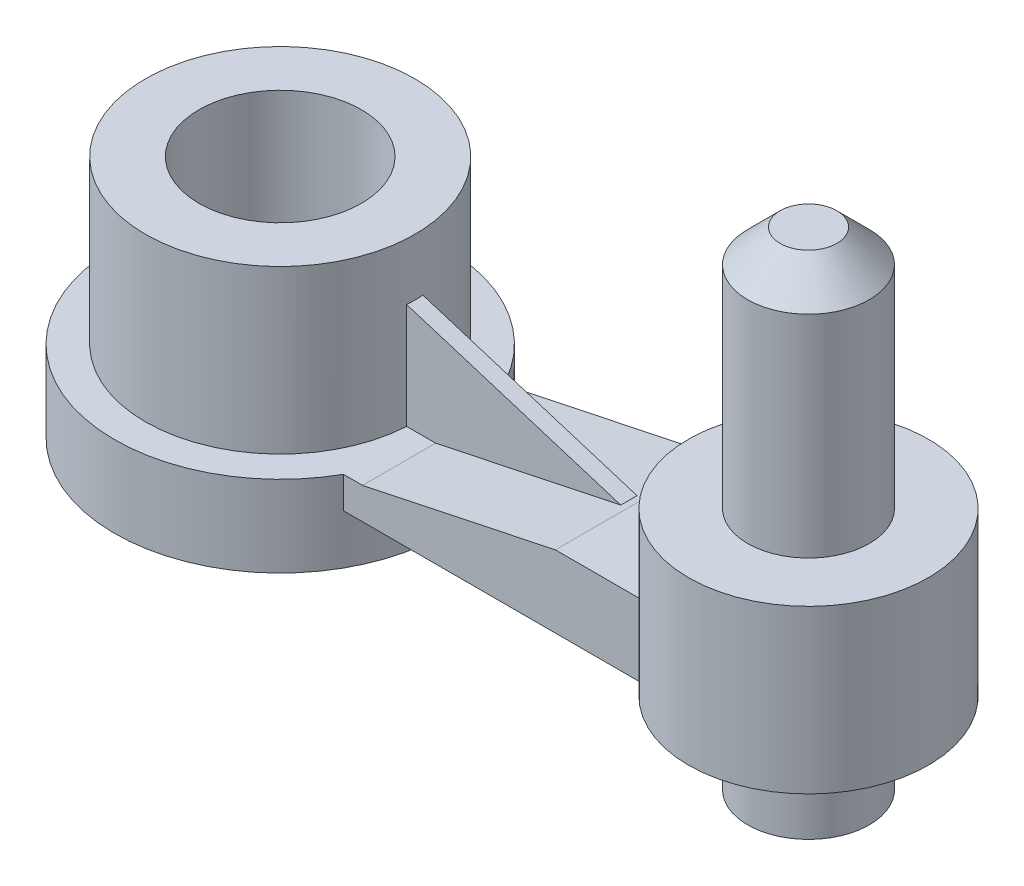
ISO-10303-21;
HEADER;
FILE_DESCRIPTION(('STEP AP214'),'2;1');
FILE_NAME('part.step','',(''),(''),'','','');
FILE_SCHEMA(('AUTOMOTIVE_DESIGN { 1 0 10303 214 1 1 1 1 }'));
ENDSEC;
DATA;
#1=APPLICATION_CONTEXT('core data for automotive mechanical design processes');
#2=APPLICATION_PROTOCOL_DEFINITION('international standard','automotive_design',2000,#1);
#3=PRODUCT_CONTEXT('',#1,'mechanical');
#4=PRODUCT('Part','Part','',(#3));
#5=PRODUCT_RELATED_PRODUCT_CATEGORY('part','',(#4));
#6=PRODUCT_DEFINITION_FORMATION('','',#4);
#7=PRODUCT_DEFINITION_CONTEXT('part definition',#1,'design');
#8=PRODUCT_DEFINITION('design','',#6,#7);
#9=PRODUCT_DEFINITION_SHAPE('','',#8);
#10=(LENGTH_UNIT() NAMED_UNIT(*) SI_UNIT(.MILLI.,.METRE.));
#11=(NAMED_UNIT(*) PLANE_ANGLE_UNIT() SI_UNIT($,.RADIAN.));
#12=(NAMED_UNIT(*) SI_UNIT($,.STERADIAN.) SOLID_ANGLE_UNIT());
#13=UNCERTAINTY_MEASURE_WITH_UNIT(LENGTH_MEASURE(1.E-05),#10,'distance_accuracy_value','');
#14=(GEOMETRIC_REPRESENTATION_CONTEXT(3) GLOBAL_UNCERTAINTY_ASSIGNED_CONTEXT((#13)) GLOBAL_UNIT_ASSIGNED_CONTEXT((#10,
#11,#12)) REPRESENTATION_CONTEXT('',''));
#15=CARTESIAN_POINT('',(0.,0.,0.));
#16=DIRECTION('',(0.,0.,1.));
#17=DIRECTION('',(1.,0.,0.));
#18=AXIS2_PLACEMENT_3D('',#15,#16,#17);
#19=CARTESIAN_POINT('',(15.2001557817542,20.5,0.612730337909637));
#20=DIRECTION('',(0.,-1.,0.));
#21=DIRECTION('',(0.,0.,1.));
#22=AXIS2_PLACEMENT_3D('',#19,#20,#21);
#23=CONICAL_SURFACE('',#22,3.745,0.78539816339745);
#24=CARTESIAN_POINT('',(15.2001557817542,22.5,0.612730337909637));
#25=DIRECTION('',(0.,1.,0.));
#26=DIRECTION('',(0.,0.,1.));
#27=AXIS2_PLACEMENT_3D('',#24,#25,#26);
#28=CIRCLE('',#27,1.745);
#29=CARTESIAN_POINT('',(15.2001557817542,22.5,2.35773033790963));
#30=VERTEX_POINT('',#29);
#31=EDGE_CURVE('E13',#30,#30,#28,.T.);
#32=ORIENTED_EDGE('',*,*,#31,.F.);
#33=EDGE_LOOP('',(#32));
#34=FACE_BOUND('',#33,.T.);
#35=CARTESIAN_POINT('',(15.2001557817542,20.5,0.612730337909637));
#36=DIRECTION('',(0.,1.,0.));
#37=DIRECTION('',(0.,0.,1.));
#38=AXIS2_PLACEMENT_3D('',#35,#36,#37);
#39=CIRCLE('',#38,3.745);
#40=CARTESIAN_POINT('',(15.2001557817542,20.5,4.35773033790964));
#41=VERTEX_POINT('',#40);
#42=EDGE_CURVE('E71',#41,#41,#39,.T.);
#43=ORIENTED_EDGE('',*,*,#42,.T.);
#44=EDGE_LOOP('',(#43));
#45=FACE_BOUND('',#44,.T.);
#46=ADVANCED_FACE('F65',(#34,#45),#23,.T.);
#47=CARTESIAN_POINT('',(15.2001557817542,22.5,0.612730337909637));
#48=DIRECTION('',(0.,1.,0.));
#49=DIRECTION('',(0.,0.,1.));
#50=AXIS2_PLACEMENT_3D('',#47,#48,#49);
#51=PLANE('',#50);
#52=ORIENTED_EDGE('',*,*,#31,.T.);
#53=EDGE_LOOP('',(#52));
#54=FACE_BOUND('',#53,.T.);
#55=ADVANCED_FACE('F80',(#54),#51,.T.);
#56=CARTESIAN_POINT('',(15.2001557817542,20.5,0.612730337909637));
#57=DIRECTION('',(0.,1.,0.));
#58=DIRECTION('',(0.,0.,1.));
#59=AXIS2_PLACEMENT_3D('',#56,#57,#58);
#60=PLANE('',#59);
#61=ORIENTED_EDGE('',*,*,#42,.F.);
#62=EDGE_LOOP('',(#61));
#63=FACE_BOUND('',#62,.T.);
#64=ADVANCED_FACE('F78',(#63),#60,.F.);
#65=CLOSED_SHELL('',(#46,#55,#64));
#66=MANIFOLD_SOLID_BREP('B2',#65);
#67=CARTESIAN_POINT('',(-17.3198442182458,0.,0.612730337909637));
#68=DIRECTION('',(0.,-1.,0.));
#69=DIRECTION('',(0.,0.,-1.));
#70=AXIS2_PLACEMENT_3D('',#67,#68,#69);
#71=PLANE('',#70);
#72=DIRECTION('',(0.,0.,-1.));
#73=VECTOR('',#72,1.);
#74=CARTESIAN_POINT('',(-7.2574485575352,0.,5.61));
#75=LINE('',#74,#73);
#76=CARTESIAN_POINT('',(-7.2574485575352,0.,5.61));
#77=VERTEX_POINT('',#76);
#78=CARTESIAN_POINT('',(-7.2574485575352,0.,1.11));
#79=VERTEX_POINT('',#78);
#80=EDGE_CURVE('E200',#77,#79,#75,.T.);
#81=ORIENTED_EDGE('',*,*,#80,.T.);
#82=DIRECTION('',(1.,0.,0.));
#83=VECTOR('',#82,1.);
#84=CARTESIAN_POINT('',(-12.1241876091032,0.,1.11));
#85=LINE('',#84,#83);
#86=CARTESIAN_POINT('',(-9.03976282473492,0.,1.11));
#87=VERTEX_POINT('',#86);
#88=EDGE_CURVE('E295',#87,#79,#85,.T.);
#89=ORIENTED_EDGE('',*,*,#88,.F.);
#90=CARTESIAN_POINT('',(-17.3198442182458,0.,0.612730337909637));
#91=DIRECTION('',(0.,1.,0.));
#92=DIRECTION('',(0.,0.,1.));
#93=AXIS2_PLACEMENT_3D('',#90,#91,#92);
#94=CIRCLE('',#93,8.295);
#95=CARTESIAN_POINT('',(-9.04009257901496,0.,0.11));
#96=VERTEX_POINT('',#95);
#97=EDGE_CURVE('E233',#96,#87,#94,.T.);
#98=ORIENTED_EDGE('',*,*,#97,.F.);
#99=DIRECTION('',(1.,0.,0.));
#100=VECTOR('',#99,1.);
#101=CARTESIAN_POINT('',(-12.1241876091032,0.,0.11));
#102=LINE('',#101,#100);
#103=CARTESIAN_POINT('',(-7.2574485575352,0.,0.11));
#104=VERTEX_POINT('',#103);
#105=EDGE_CURVE('E129',#96,#104,#102,.T.);
#106=ORIENTED_EDGE('',*,*,#105,.T.);
#107=CARTESIAN_POINT('',(-7.2574485575352,0.,-4.39));
#108=VERTEX_POINT('',#107);
#109=EDGE_CURVE('E203',#104,#108,#75,.T.);
#110=ORIENTED_EDGE('',*,*,#109,.T.);
#111=DIRECTION('',(-1.,0.,0.));
#112=VECTOR('',#111,1.);
#113=CARTESIAN_POINT('',(-7.12484421824576,0.,-4.39));
#114=LINE('',#113,#112);
#115=CARTESIAN_POINT('',(-8.43667394147191,0.,-4.39));
#116=VERTEX_POINT('',#115);
#117=EDGE_CURVE('E258',#108,#116,#114,.T.);
#118=ORIENTED_EDGE('',*,*,#117,.T.);
#119=CARTESIAN_POINT('',(-17.3198442182458,0.,0.612730337909637));
#120=DIRECTION('',(0.,-1.,0.));
#121=DIRECTION('',(0.,0.,-1.));
#122=AXIS2_PLACEMENT_3D('',#119,#120,#121);
#123=CIRCLE('',#122,10.195);
#124=CARTESIAN_POINT('',(-8.43360086549252,0.,5.61));
#125=VERTEX_POINT('',#124);
#126=EDGE_CURVE('E229',#125,#116,#123,.T.);
#127=ORIENTED_EDGE('',*,*,#126,.F.);
#128=DIRECTION('',(-1.,0.,0.));
#129=VECTOR('',#128,1.);
#130=CARTESIAN_POINT('',(-7.12484421824576,0.,5.61));
#131=LINE('',#130,#129);
#132=EDGE_CURVE('E256',#77,#125,#131,.T.);
#133=ORIENTED_EDGE('',*,*,#132,.F.);
#134=EDGE_LOOP('',(#81,#89,#98,#106,#110,#118,#127,#133));
#135=FACE_BOUND('',#134,.T.);
#136=ADVANCED_FACE('F114',(#135),#71,.F.);
#137=CARTESIAN_POINT('',(-9.02484421824577,6.49584873086382,1.11));
#138=DIRECTION('',(-0.297041581577032,-0.954864544746644,0.));
#139=DIRECTION('',(0.954864544746644,-0.297041581577032,0.));
#140=AXIS2_PLACEMENT_3D('',#137,#138,#139);
#141=PLANE('',#140);
#142=DIRECTION('',(0.,0.,1.));
#143=VECTOR('',#142,1.);
#144=CARTESIAN_POINT('',(4.14299155355654,2.39956639938339,1.11));
#145=LINE('',#144,#143);
#146=CARTESIAN_POINT('',(4.14299155355653,2.39956639938339,0.11));
#147=VERTEX_POINT('',#146);
#148=CARTESIAN_POINT('',(4.14299155355654,2.39956639938339,1.11));
#149=VERTEX_POINT('',#148);
#150=EDGE_CURVE('E301',#147,#149,#145,.T.);
#151=ORIENTED_EDGE('',*,*,#150,.F.);
#152=DIRECTION('',(-0.954864544746644,0.297041581577032,0.));
#153=VECTOR('',#152,1.);
#154=CARTESIAN_POINT('',(-9.02484421824577,6.49584873086382,0.11));
#155=LINE('',#154,#153);
#156=CARTESIAN_POINT('',(-9.04009257901496,6.50059222796428,0.11));
#157=VERTEX_POINT('',#156);
#158=EDGE_CURVE('E293',#147,#157,#155,.T.);
#159=ORIENTED_EDGE('',*,*,#158,.T.);
#160=CARTESIAN_POINT('',(-17.3198442182458,9.0762774762156,0.612730337909637));
#161=DIRECTION('',(-0.297041581577032,-0.954864544746644,0.));
#162=DIRECTION('',(0.954864544746644,-0.297041581577032,0.));
#163=AXIS2_PLACEMENT_3D('',#160,#161,#162);
#164=ELLIPSE('',#163,8.68709603433954,8.295);
#165=CARTESIAN_POINT('',(-9.03976282473492,6.500489647202,1.11));
#166=VERTEX_POINT('',#165);
#167=EDGE_CURVE('E282',#157,#166,#164,.T.);
#168=ORIENTED_EDGE('',*,*,#167,.T.);
#169=DIRECTION('',(-0.954864544746644,0.297041581577032,0.));
#170=VECTOR('',#169,1.);
#171=CARTESIAN_POINT('',(4.14515578175423,2.39889314601958,1.11));
#172=LINE('',#171,#170);
#173=EDGE_CURVE('E292',#149,#166,#172,.T.);
#174=ORIENTED_EDGE('',*,*,#173,.F.);
#175=EDGE_LOOP('',(#151,#159,#168,#174));
#176=FACE_BOUND('',#175,.T.);
#177=ADVANCED_FACE('F323',(#176),#141,.F.);
#178=CARTESIAN_POINT('',(0.,0.,1.11));
#179=DIRECTION('',(0.,0.,-1.));
#180=DIRECTION('',(-1.,0.,0.));
#181=AXIS2_PLACEMENT_3D('',#178,#179,#180);
#182=PLANE('',#181);
#183=DIRECTION('',(-0.978558890170466,-0.205967226685084,0.));
#184=VECTOR('',#183,1.);
#185=CARTESIAN_POINT('',(-0.307879100316129,1.46274645515655,1.11));
#186=LINE('',#185,#184);
#187=EDGE_CURVE('E297',#149,#79,#186,.T.);
#188=ORIENTED_EDGE('',*,*,#187,.F.);
#189=ORIENTED_EDGE('',*,*,#173,.T.);
#190=DIRECTION('',(0.,-1.,0.));
#191=VECTOR('',#190,1.);
#192=CARTESIAN_POINT('',(-9.03976282473492,10.,1.11));
#193=LINE('',#192,#191);
#194=EDGE_CURVE('E287',#166,#87,#193,.T.);
#195=ORIENTED_EDGE('',*,*,#194,.T.);
#196=ORIENTED_EDGE('',*,*,#88,.T.);
#197=EDGE_LOOP('',(#188,#189,#195,#196));
#198=FACE_BOUND('',#197,.T.);
#199=ADVANCED_FACE('F329',(#198),#182,.F.);
#200=CARTESIAN_POINT('',(0.,0.,0.11));
#201=DIRECTION('',(0.,0.,-1.));
#202=DIRECTION('',(-1.,0.,0.));
#203=AXIS2_PLACEMENT_3D('',#200,#201,#202);
#204=PLANE('',#203);
#205=ORIENTED_EDGE('',*,*,#158,.F.);
#206=DIRECTION('',(-0.978558890170466,-0.205967226685084,0.));
#207=VECTOR('',#206,1.);
#208=CARTESIAN_POINT('',(-0.307879100316129,1.46274645515655,0.11));
#209=LINE('',#208,#207);
#210=EDGE_CURVE('E63',#147,#104,#209,.T.);
#211=ORIENTED_EDGE('',*,*,#210,.T.);
#212=ORIENTED_EDGE('',*,*,#105,.F.);
#213=DIRECTION('',(0.,-1.,0.));
#214=VECTOR('',#213,1.);
#215=CARTESIAN_POINT('',(-9.04009257901496,10.,0.11));
#216=LINE('',#215,#214);
#217=EDGE_CURVE('E289',#157,#96,#216,.T.);
#218=ORIENTED_EDGE('',*,*,#217,.F.);
#219=EDGE_LOOP('',(#205,#211,#212,#218));
#220=FACE_BOUND('',#219,.T.);
#221=ADVANCED_FACE('F360',(#220),#204,.T.);
#222=CARTESIAN_POINT('',(-17.3198442182458,10.,0.612730337909637));
#223=DIRECTION('',(0.,-1.,0.));
#224=DIRECTION('',(0.,0.,-1.));
#225=AXIS2_PLACEMENT_3D('',#222,#223,#224);
#226=CYLINDRICAL_SURFACE('',#225,8.295);
#227=CARTESIAN_POINT('',(-17.3198442182458,10.,0.612730337909637));
#228=DIRECTION('',(0.,1.,0.));
#229=DIRECTION('',(0.,0.,1.));
#230=AXIS2_PLACEMENT_3D('',#227,#228,#229);
#231=CIRCLE('',#230,8.295);
#232=CARTESIAN_POINT('',(-17.3198442182458,10.,8.90773033790964));
#233=VERTEX_POINT('',#232);
#234=EDGE_CURVE('E239',#233,#233,#231,.T.);
#235=ORIENTED_EDGE('',*,*,#234,.F.);
#236=EDGE_LOOP('',(#235));
#237=FACE_BOUND('',#236,.T.);
#238=ORIENTED_EDGE('',*,*,#194,.F.);
#239=ORIENTED_EDGE('',*,*,#167,.F.);
#240=ORIENTED_EDGE('',*,*,#217,.T.);
#241=ORIENTED_EDGE('',*,*,#97,.T.);
#242=EDGE_LOOP('',(#238,#239,#240,#241));
#243=FACE_BOUND('',#242,.T.);
#244=ADVANCED_FACE('F116',(#237,#243),#226,.T.);
#245=CARTESIAN_POINT('',(0.,0.,5.61));
#246=DIRECTION('',(0.,0.,1.));
#247=DIRECTION('',(1.,0.,0.));
#248=AXIS2_PLACEMENT_3D('',#245,#246,#247);
#249=PLANE('',#248);
#250=DIRECTION('',(-0.978558890170466,-0.205967226685084,0.));
#251=VECTOR('',#250,1.);
#252=CARTESIAN_POINT('',(-7.2574485575352,0.,5.61));
#253=LINE('',#252,#251);
#254=CARTESIAN_POINT('',(4.62015578175423,2.5,5.61));
#255=VERTEX_POINT('',#254);
#256=EDGE_CURVE('E192',#255,#77,#253,.T.);
#257=ORIENTED_EDGE('',*,*,#256,.T.);
#258=ORIENTED_EDGE('',*,*,#132,.T.);
#259=DIRECTION('',(0.,1.,0.));
#260=VECTOR('',#259,1.);
#261=CARTESIAN_POINT('',(-8.43360086549252,-5.,5.61));
#262=LINE('',#261,#260);
#263=CARTESIAN_POINT('',(-8.43360086549252,-1.94,5.61));
#264=VERTEX_POINT('',#263);
#265=EDGE_CURVE('E222',#264,#125,#262,.T.);
#266=ORIENTED_EDGE('',*,*,#265,.F.);
#267=DIRECTION('',(1.,0.,0.));
#268=VECTOR('',#267,1.);
#269=CARTESIAN_POINT('',(-8.47900773463957,-1.94,5.61));
#270=LINE('',#269,#268);
#271=CARTESIAN_POINT('',(9.76273719161872,-1.94,5.61));
#272=VERTEX_POINT('',#271);
#273=EDGE_CURVE('E214',#264,#272,#270,.T.);
#274=ORIENTED_EDGE('',*,*,#273,.T.);
#275=DIRECTION('',(0.,-1.,0.));
#276=VECTOR('',#275,1.);
#277=CARTESIAN_POINT('',(9.76273719161872,7.5,5.61));
#278=LINE('',#277,#276);
#279=CARTESIAN_POINT('',(9.76273719161872,2.5,5.61));
#280=VERTEX_POINT('',#279);
#281=EDGE_CURVE('E212',#272,#280,#278,.F.);
#282=ORIENTED_EDGE('',*,*,#281,.T.);
#283=DIRECTION('',(-1.,0.,0.));
#284=VECTOR('',#283,1.);
#285=CARTESIAN_POINT('',(9.97528145187715,2.5,5.61));
#286=LINE('',#285,#284);
#287=EDGE_CURVE('E208',#280,#255,#286,.T.);
#288=ORIENTED_EDGE('',*,*,#287,.T.);
#289=EDGE_LOOP('',(#257,#258,#266,#274,#282,#288));
#290=FACE_BOUND('',#289,.T.);
#291=ADVANCED_FACE('F209',(#290),#249,.T.);
#292=CARTESIAN_POINT('',(0.,0.,-4.39));
#293=DIRECTION('',(0.,0.,1.));
#294=DIRECTION('',(1.,0.,0.));
#295=AXIS2_PLACEMENT_3D('',#292,#293,#294);
#296=PLANE('',#295);
#297=ORIENTED_EDGE('',*,*,#117,.F.);
#298=DIRECTION('',(-0.978558890170466,-0.205967226685084,0.));
#299=VECTOR('',#298,1.);
#300=CARTESIAN_POINT('',(-7.2574485575352,0.,-4.39));
#301=LINE('',#300,#299);
#302=CARTESIAN_POINT('',(4.62015578175423,2.5,-4.39));
#303=VERTEX_POINT('',#302);
#304=EDGE_CURVE('E204',#303,#108,#301,.T.);
#305=ORIENTED_EDGE('',*,*,#304,.F.);
#306=DIRECTION('',(-1.,0.,0.));
#307=VECTOR('',#306,1.);
#308=CARTESIAN_POINT('',(9.97528145187715,2.5,-4.39));
#309=LINE('',#308,#307);
#310=CARTESIAN_POINT('',(9.7677608986333,2.5,-4.39));
#311=VERTEX_POINT('',#310);
#312=EDGE_CURVE('E218',#311,#303,#309,.T.);
#313=ORIENTED_EDGE('',*,*,#312,.F.);
#314=DIRECTION('',(0.,-1.,0.));
#315=VECTOR('',#314,1.);
#316=CARTESIAN_POINT('',(9.7677608986333,7.5,-4.39));
#317=LINE('',#316,#315);
#318=CARTESIAN_POINT('',(9.7677608986333,-1.94,-4.39));
#319=VERTEX_POINT('',#318);
#320=EDGE_CURVE('E252',#319,#311,#317,.F.);
#321=ORIENTED_EDGE('',*,*,#320,.F.);
#322=DIRECTION('',(1.,0.,0.));
#323=VECTOR('',#322,1.);
#324=CARTESIAN_POINT('',(-8.47900773463957,-1.94,-4.39));
#325=LINE('',#324,#323);
#326=CARTESIAN_POINT('',(-8.43667394147191,-1.94,-4.39));
#327=VERTEX_POINT('',#326);
#328=EDGE_CURVE('E137',#327,#319,#325,.T.);
#329=ORIENTED_EDGE('',*,*,#328,.F.);
#330=DIRECTION('',(0.,1.,0.));
#331=VECTOR('',#330,1.);
#332=CARTESIAN_POINT('',(-8.43667394147191,-5.,-4.39));
#333=LINE('',#332,#331);
#334=EDGE_CURVE('E219',#327,#116,#333,.T.);
#335=ORIENTED_EDGE('',*,*,#334,.T.);
#336=EDGE_LOOP('',(#297,#305,#313,#321,#329,#335));
#337=FACE_BOUND('',#336,.T.);
#338=ADVANCED_FACE('F255',(#337),#296,.F.);
#339=CARTESIAN_POINT('',(-17.3198442182458,10.,0.612730337909637));
#340=DIRECTION('',(0.,1.,0.));
#341=DIRECTION('',(0.,0.,1.));
#342=AXIS2_PLACEMENT_3D('',#339,#340,#341);
#343=PLANE('',#342);
#344=ORIENTED_EDGE('',*,*,#234,.T.);
#345=EDGE_LOOP('',(#344));
#346=FACE_BOUND('',#345,.T.);
#347=CARTESIAN_POINT('',(-17.3198442182458,10.,0.612730337909637));
#348=DIRECTION('',(0.,1.,0.));
#349=DIRECTION('',(0.,0.,1.));
#350=AXIS2_PLACEMENT_3D('',#347,#348,#349);
#351=CIRCLE('',#350,5.);
#352=CARTESIAN_POINT('',(-17.3198442182458,10.,5.61273033790964));
#353=VERTEX_POINT('',#352);
#354=EDGE_CURVE('E236',#353,#353,#351,.T.);
#355=ORIENTED_EDGE('',*,*,#354,.F.);
#356=EDGE_LOOP('',(#355));
#357=FACE_BOUND('',#356,.T.);
#358=ADVANCED_FACE('F341',(#346,#357),#343,.T.);
#359=CARTESIAN_POINT('',(-17.3198442182458,10.,0.612730337909637));
#360=DIRECTION('',(0.,-1.,0.));
#361=DIRECTION('',(0.,0.,-1.));
#362=AXIS2_PLACEMENT_3D('',#359,#360,#361);
#363=CYLINDRICAL_SURFACE('',#362,5.);
#364=ORIENTED_EDGE('',*,*,#354,.T.);
#365=EDGE_LOOP('',(#364));
#366=FACE_BOUND('',#365,.T.);
#367=CARTESIAN_POINT('',(-17.3198442182458,0.,0.612730337909637));
#368=DIRECTION('',(0.,1.,0.));
#369=DIRECTION('',(0.,0.,1.));
#370=AXIS2_PLACEMENT_3D('',#367,#368,#369);
#371=CIRCLE('',#370,5.);
#372=CARTESIAN_POINT('',(-17.3198442182458,0.,5.61273033790964));
#373=VERTEX_POINT('',#372);
#374=EDGE_CURVE('E240',#373,#373,#371,.T.);
#375=ORIENTED_EDGE('',*,*,#374,.F.);
#376=EDGE_LOOP('',(#375));
#377=FACE_BOUND('',#376,.T.);
#378=ADVANCED_FACE('F334',(#366,#377),#363,.F.);
#379=ORIENTED_EDGE('',*,*,#374,.T.);
#380=EDGE_LOOP('',(#379));
#381=FACE_BOUND('',#380,.T.);
#382=ADVANCED_FACE('F325',(#381),#71,.F.);
#383=CARTESIAN_POINT('',(-17.3198442182458,-5.,0.612730337909637));
#384=DIRECTION('',(0.,1.,0.));
#385=DIRECTION('',(0.,0.,1.));
#386=AXIS2_PLACEMENT_3D('',#383,#384,#385);
#387=CYLINDRICAL_SURFACE('',#386,10.195);
#388=CARTESIAN_POINT('',(-17.3198442182458,-5.,0.612730337909637));
#389=DIRECTION('',(0.,-1.,0.));
#390=DIRECTION('',(0.,0.,-1.));
#391=AXIS2_PLACEMENT_3D('',#388,#389,#390);
#392=CIRCLE('',#391,10.195);
#393=CARTESIAN_POINT('',(-17.3198442182458,-5.,-9.58226966209036));
#394=VERTEX_POINT('',#393);
#395=EDGE_CURVE('E230',#394,#394,#392,.T.);
#396=ORIENTED_EDGE('',*,*,#395,.F.);
#397=EDGE_LOOP('',(#396));
#398=FACE_BOUND('',#397,.T.);
#399=CARTESIAN_POINT('',(-17.3198442182458,-1.94,0.612730337909637));
#400=DIRECTION('',(0.,1.,0.));
#401=DIRECTION('',(-1.,0.,0.));
#402=AXIS2_PLACEMENT_3D('',#399,#400,#401);
#403=CIRCLE('',#402,10.195);
#404=EDGE_CURVE('E245',#264,#327,#403,.T.);
#405=ORIENTED_EDGE('',*,*,#404,.F.);
#406=ORIENTED_EDGE('',*,*,#265,.T.);
#407=ORIENTED_EDGE('',*,*,#126,.T.);
#408=ORIENTED_EDGE('',*,*,#334,.F.);
#409=EDGE_LOOP('',(#405,#406,#407,#408));
#410=FACE_BOUND('',#409,.T.);
#411=ADVANCED_FACE('F307',(#398,#410),#387,.T.);
#412=CARTESIAN_POINT('',(-17.3198442182458,-5.,0.612730337909637));
#413=DIRECTION('',(0.,-1.,0.));
#414=DIRECTION('',(0.,0.,-1.));
#415=AXIS2_PLACEMENT_3D('',#412,#413,#414);
#416=PLANE('',#415);
#417=ORIENTED_EDGE('',*,*,#395,.T.);
#418=EDGE_LOOP('',(#417));
#419=FACE_BOUND('',#418,.T.);
#420=ADVANCED_FACE('F313',(#419),#416,.T.);
#421=CARTESIAN_POINT('',(-8.47900773463957,-1.94,5.61));
#422=DIRECTION('',(0.,1.,0.));
#423=DIRECTION('',(-1.,0.,0.));
#424=AXIS2_PLACEMENT_3D('',#421,#422,#423);
#425=PLANE('',#424);
#426=ORIENTED_EDGE('',*,*,#404,.T.);
#427=ORIENTED_EDGE('',*,*,#328,.T.);
#428=CARTESIAN_POINT('',(15.2001557817542,-1.94,0.612730337909637));
#429=DIRECTION('',(0.,1.,0.));
#430=DIRECTION('',(-1.,0.,0.));
#431=AXIS2_PLACEMENT_3D('',#428,#429,#430);
#432=CIRCLE('',#431,7.385);
#433=EDGE_CURVE('E259',#272,#319,#432,.F.);
#434=ORIENTED_EDGE('',*,*,#433,.F.);
#435=ORIENTED_EDGE('',*,*,#273,.F.);
#436=EDGE_LOOP('',(#426,#427,#434,#435));
#437=FACE_BOUND('',#436,.T.);
#438=ADVANCED_FACE('F311',(#437),#425,.F.);
#439=CARTESIAN_POINT('',(9.97528145187715,2.5,5.61));
#440=DIRECTION('',(0.,-1.,0.));
#441=DIRECTION('',(0.,0.,-1.));
#442=AXIS2_PLACEMENT_3D('',#439,#440,#441);
#443=PLANE('',#442);
#444=ORIENTED_EDGE('',*,*,#287,.F.);
#445=CARTESIAN_POINT('',(15.2001557817542,2.5,0.612730337909637));
#446=DIRECTION('',(0.,-1.,0.));
#447=DIRECTION('',(0.,0.,-1.));
#448=AXIS2_PLACEMENT_3D('',#445,#446,#447);
#449=CIRCLE('',#448,7.385);
#450=EDGE_CURVE('E122',#311,#280,#449,.F.);
#451=ORIENTED_EDGE('',*,*,#450,.F.);
#452=ORIENTED_EDGE('',*,*,#312,.T.);
#453=DIRECTION('',(0.,0.,-1.));
#454=VECTOR('',#453,1.);
#455=CARTESIAN_POINT('',(4.62015578175423,2.5,5.61));
#456=LINE('',#455,#454);
#457=EDGE_CURVE('E196',#255,#303,#456,.T.);
#458=ORIENTED_EDGE('',*,*,#457,.F.);
#459=EDGE_LOOP('',(#444,#451,#452,#458));
#460=FACE_BOUND('',#459,.T.);
#461=ADVANCED_FACE('F216',(#460),#443,.F.);
#462=CARTESIAN_POINT('',(15.2001557817542,7.5,0.612730337909637));
#463=DIRECTION('',(0.,-1.,0.));
#464=DIRECTION('',(0.,0.,-1.));
#465=AXIS2_PLACEMENT_3D('',#462,#463,#464);
#466=CYLINDRICAL_SURFACE('',#465,7.385);
#467=CARTESIAN_POINT('',(15.2001557817542,7.5,0.612730337909637));
#468=DIRECTION('',(0.,1.,0.));
#469=DIRECTION('',(0.,0.,1.));
#470=AXIS2_PLACEMENT_3D('',#467,#468,#469);
#471=CIRCLE('',#470,7.385);
#472=CARTESIAN_POINT('',(15.2001557817542,7.5,7.99773033790964));
#473=VERTEX_POINT('',#472);
#474=EDGE_CURVE('E267',#473,#473,#471,.T.);
#475=ORIENTED_EDGE('',*,*,#474,.F.);
#476=EDGE_LOOP('',(#475));
#477=FACE_BOUND('',#476,.T.);
#478=CARTESIAN_POINT('',(15.2001557817542,-2.5,0.612730337909637));
#479=DIRECTION('',(0.,1.,0.));
#480=DIRECTION('',(0.,0.,1.));
#481=AXIS2_PLACEMENT_3D('',#478,#479,#480);
#482=CIRCLE('',#481,7.385);
#483=CARTESIAN_POINT('',(15.2001557817542,-2.5,7.99773033790964));
#484=VERTEX_POINT('',#483);
#485=EDGE_CURVE('E270',#484,#484,#482,.T.);
#486=ORIENTED_EDGE('',*,*,#485,.T.);
#487=EDGE_LOOP('',(#486));
#488=FACE_BOUND('',#487,.T.);
#489=ORIENTED_EDGE('',*,*,#281,.F.);
#490=ORIENTED_EDGE('',*,*,#433,.T.);
#491=ORIENTED_EDGE('',*,*,#320,.T.);
#492=ORIENTED_EDGE('',*,*,#450,.T.);
#493=EDGE_LOOP('',(#489,#490,#491,#492));
#494=FACE_BOUND('',#493,.T.);
#495=ADVANCED_FACE('F250',(#477,#488,#494),#466,.T.);
#496=CARTESIAN_POINT('',(15.2001557817542,7.5,0.612730337909637));
#497=DIRECTION('',(0.,1.,0.));
#498=DIRECTION('',(0.,0.,1.));
#499=AXIS2_PLACEMENT_3D('',#496,#497,#498);
#500=PLANE('',#499);
#501=CARTESIAN_POINT('',(15.2001557817542,7.5,0.612730337909637));
#502=DIRECTION('',(0.,1.,0.));
#503=DIRECTION('',(0.,0.,1.));
#504=AXIS2_PLACEMENT_3D('',#501,#502,#503);
#505=CIRCLE('',#504,3.745);
#506=CARTESIAN_POINT('',(15.2001557817542,7.5,4.35773033790964));
#507=VERTEX_POINT('',#506);
#508=EDGE_CURVE('E273',#507,#507,#505,.F.);
#509=ORIENTED_EDGE('',*,*,#508,.T.);
#510=EDGE_LOOP('',(#509));
#511=FACE_BOUND('',#510,.T.);
#512=ORIENTED_EDGE('',*,*,#474,.T.);
#513=EDGE_LOOP('',(#512));
#514=FACE_BOUND('',#513,.T.);
#515=ADVANCED_FACE('F397',(#511,#514),#500,.T.);
#516=CARTESIAN_POINT('',(15.2001557817542,-2.5,0.612730337909637));
#517=DIRECTION('',(0.,1.,0.));
#518=DIRECTION('',(0.,0.,1.));
#519=AXIS2_PLACEMENT_3D('',#516,#517,#518);
#520=PLANE('',#519);
#521=CARTESIAN_POINT('',(15.2001557817542,-2.5,0.612730337909637));
#522=DIRECTION('',(0.,-1.,0.));
#523=DIRECTION('',(0.,0.,-1.));
#524=AXIS2_PLACEMENT_3D('',#521,#522,#523);
#525=CIRCLE('',#524,3.745);
#526=CARTESIAN_POINT('',(15.2001557817542,-2.5,-3.13226966209036));
#527=VERTEX_POINT('',#526);
#528=EDGE_CURVE('E266',#527,#527,#525,.T.);
#529=ORIENTED_EDGE('',*,*,#528,.F.);
#530=EDGE_LOOP('',(#529));
#531=FACE_BOUND('',#530,.T.);
#532=ORIENTED_EDGE('',*,*,#485,.F.);
#533=EDGE_LOOP('',(#532));
#534=FACE_BOUND('',#533,.T.);
#535=ADVANCED_FACE('F393',(#531,#534),#520,.F.);
#536=CARTESIAN_POINT('',(15.2001557817542,20.5,0.612730337909637));
#537=DIRECTION('',(0.,-1.,0.));
#538=DIRECTION('',(0.,0.,-1.));
#539=AXIS2_PLACEMENT_3D('',#536,#537,#538);
#540=CYLINDRICAL_SURFACE('',#539,3.745);
#541=ORIENTED_EDGE('',*,*,#508,.F.);
#542=EDGE_LOOP('',(#541));
#543=FACE_BOUND('',#542,.T.);
#544=CARTESIAN_POINT('',(15.2001557817542,20.5,0.612730337909637));
#545=DIRECTION('',(0.,1.,0.));
#546=DIRECTION('',(0.,0.,1.));
#547=AXIS2_PLACEMENT_3D('',#544,#545,#546);
#548=CIRCLE('',#547,3.745);
#549=CARTESIAN_POINT('',(15.2001557817542,20.5,4.35773033790964));
#550=VERTEX_POINT('',#549);
#551=EDGE_CURVE('E276',#550,#550,#548,.T.);
#552=ORIENTED_EDGE('',*,*,#551,.F.);
#553=EDGE_LOOP('',(#552));
#554=FACE_BOUND('',#553,.T.);
#555=ADVANCED_FACE('F389',(#543,#554),#540,.T.);
#556=CARTESIAN_POINT('',(15.2001557817542,20.5,0.612730337909637));
#557=DIRECTION('',(0.,1.,0.));
#558=DIRECTION('',(0.,0.,1.));
#559=AXIS2_PLACEMENT_3D('',#556,#557,#558);
#560=PLANE('',#559);
#561=ORIENTED_EDGE('',*,*,#551,.T.);
#562=EDGE_LOOP('',(#561));
#563=FACE_BOUND('',#562,.T.);
#564=ADVANCED_FACE('F382',(#563),#560,.T.);
#565=CARTESIAN_POINT('',(15.2001557817542,-7.5,0.612730337909637));
#566=DIRECTION('',(0.,-1.,0.));
#567=DIRECTION('',(0.,0.,-1.));
#568=AXIS2_PLACEMENT_3D('',#565,#566,#567);
#569=PLANE('',#568);
#570=CARTESIAN_POINT('',(15.2001557817542,-7.5,0.612730337909637));
#571=DIRECTION('',(0.,-1.,0.));
#572=DIRECTION('',(0.,0.,-1.));
#573=AXIS2_PLACEMENT_3D('',#570,#571,#572);
#574=CIRCLE('',#573,3.745);
#575=CARTESIAN_POINT('',(15.2001557817542,-7.5,-3.13226966209036));
#576=VERTEX_POINT('',#575);
#577=EDGE_CURVE('E279',#576,#576,#574,.T.);
#578=ORIENTED_EDGE('',*,*,#577,.T.);
#579=EDGE_LOOP('',(#578));
#580=FACE_BOUND('',#579,.T.);
#581=ADVANCED_FACE('F378',(#580),#569,.T.);
#582=CARTESIAN_POINT('',(15.2001557817542,-7.5,0.612730337909637));
#583=DIRECTION('',(0.,1.,0.));
#584=DIRECTION('',(0.,0.,1.));
#585=AXIS2_PLACEMENT_3D('',#582,#583,#584);
#586=CYLINDRICAL_SURFACE('',#585,3.745);
#587=ORIENTED_EDGE('',*,*,#577,.F.);
#588=EDGE_LOOP('',(#587));
#589=FACE_BOUND('',#588,.T.);
#590=ORIENTED_EDGE('',*,*,#528,.T.);
#591=EDGE_LOOP('',(#590));
#592=FACE_BOUND('',#591,.T.);
#593=ADVANCED_FACE('F381',(#589,#592),#586,.T.);
#594=CARTESIAN_POINT('',(-7.2574485575352,0.,5.61));
#595=DIRECTION('',(0.205967226685084,-0.978558890170466,0.));
#596=DIRECTION('',(0.978558890170466,0.205967226685084,0.));
#597=AXIS2_PLACEMENT_3D('',#594,#595,#596);
#598=PLANE('',#597);
#599=ORIENTED_EDGE('',*,*,#150,.T.);
#600=ORIENTED_EDGE('',*,*,#187,.T.);
#601=ORIENTED_EDGE('',*,*,#80,.F.);
#602=ORIENTED_EDGE('',*,*,#256,.F.);
#603=ORIENTED_EDGE('',*,*,#457,.T.);
#604=ORIENTED_EDGE('',*,*,#304,.T.);
#605=ORIENTED_EDGE('',*,*,#109,.F.);
#606=ORIENTED_EDGE('',*,*,#210,.F.);
#607=EDGE_LOOP('',(#599,#600,#601,#602,#603,#604,#605,#606));
#608=FACE_BOUND('',#607,.T.);
#609=ADVANCED_FACE('F194',(#608),#598,.F.);
#610=CLOSED_SHELL('',(#136,#177,#199,#221,#244,#291,#338,#358,#378,#382,#411,#420,#438,#461,
#495,#515,#535,#555,#564,#581,#593,#609));
#611=MANIFOLD_SOLID_BREP('B8',#610);
#612=ADVANCED_BREP_SHAPE_REPRESENTATION('',(#18,#66,#611),#14);
#613=SHAPE_DEFINITION_REPRESENTATION(#9,#612);
ENDSEC;
END-ISO-10303-21;
